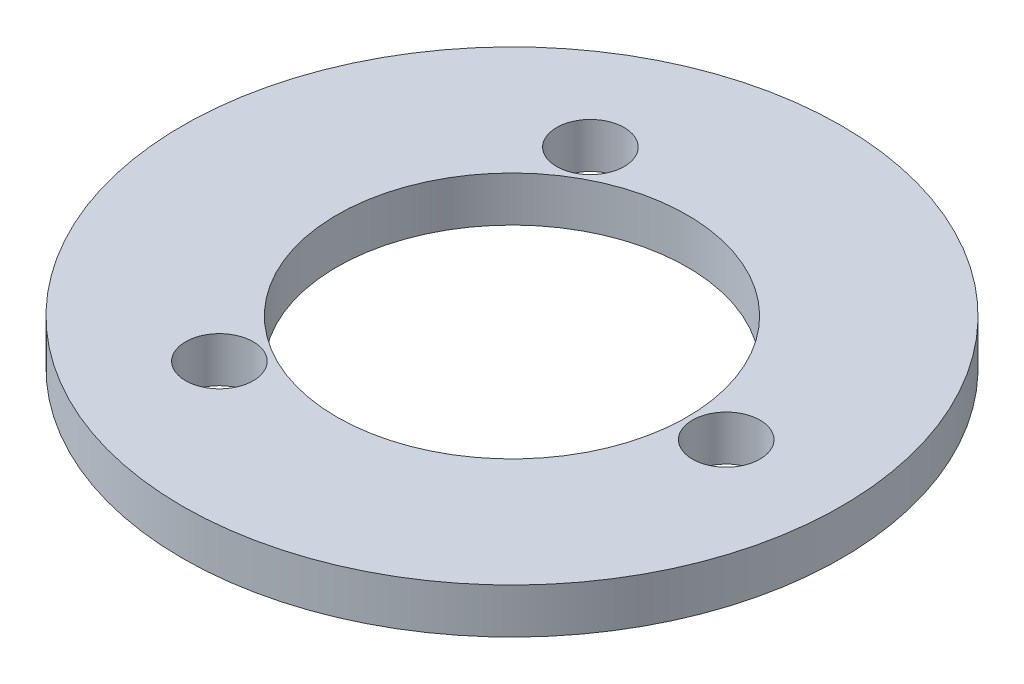
ISO-10303-21;
HEADER;
FILE_DESCRIPTION(('STEP AP214'),'2;1');
FILE_NAME('part.step','',(''),(''),'','','');
FILE_SCHEMA(('AUTOMOTIVE_DESIGN { 1 0 10303 214 1 1 1 1 }'));
ENDSEC;
DATA;
#1=APPLICATION_CONTEXT('core data for automotive mechanical design processes');
#2=APPLICATION_PROTOCOL_DEFINITION('international standard','automotive_design',2000,#1);
#3=PRODUCT_CONTEXT('',#1,'mechanical');
#4=PRODUCT('Part','Part','',(#3));
#5=PRODUCT_RELATED_PRODUCT_CATEGORY('part','',(#4));
#6=PRODUCT_DEFINITION_FORMATION('','',#4);
#7=PRODUCT_DEFINITION_CONTEXT('part definition',#1,'design');
#8=PRODUCT_DEFINITION('design','',#6,#7);
#9=PRODUCT_DEFINITION_SHAPE('','',#8);
#10=(LENGTH_UNIT() NAMED_UNIT(*) SI_UNIT(.MILLI.,.METRE.));
#11=(NAMED_UNIT(*) PLANE_ANGLE_UNIT() SI_UNIT($,.RADIAN.));
#12=(NAMED_UNIT(*) SI_UNIT($,.STERADIAN.) SOLID_ANGLE_UNIT());
#13=UNCERTAINTY_MEASURE_WITH_UNIT(LENGTH_MEASURE(1.E-05),#10,'distance_accuracy_value','');
#14=(GEOMETRIC_REPRESENTATION_CONTEXT(3) GLOBAL_UNCERTAINTY_ASSIGNED_CONTEXT((#13)) GLOBAL_UNIT_ASSIGNED_CONTEXT((#10,
#11,#12)) REPRESENTATION_CONTEXT('',''));
#15=CARTESIAN_POINT('',(0.,0.,0.));
#16=DIRECTION('',(0.,0.,1.));
#17=DIRECTION('',(1.,0.,0.));
#18=AXIS2_PLACEMENT_3D('',#15,#16,#17);
#19=CARTESIAN_POINT('',(-32.2459037817281,2.,-16.7860364028635));
#20=DIRECTION('',(0.,1.,0.));
#21=DIRECTION('',(0.,0.,1.));
#22=AXIS2_PLACEMENT_3D('',#19,#20,#21);
#23=PLANE('',#22);
#24=CARTESIAN_POINT('',(-36.9959234143415,2.,-25.0132664038902));
#25=DIRECTION('',(0.,1.,0.));
#26=DIRECTION('',(0.,0.,1.));
#27=AXIS2_PLACEMENT_3D('',#24,#25,#26);
#28=CIRCLE('',#27,1.50000000000053);
#29=CARTESIAN_POINT('',(-36.9959234143415,2.,-23.5132664038897));
#30=VERTEX_POINT('',#29);
#31=EDGE_CURVE('E64',#30,#30,#28,.T.);
#32=ORIENTED_EDGE('',*,*,#31,.F.);
#33=EDGE_LOOP('',(#32));
#34=FACE_BOUND('',#33,.T.);
#35=CARTESIAN_POINT('',(-32.2459037817281,2.,-16.7860364028635));
#36=DIRECTION('',(0.,1.,0.));
#37=DIRECTION('',(0.,0.,1.));
#38=AXIS2_PLACEMENT_3D('',#35,#36,#37);
#39=CIRCLE('',#38,7.76673220483759);
#40=CARTESIAN_POINT('',(-32.2459037817281,2.,-9.01930419802594));
#41=VERTEX_POINT('',#40);
#42=EDGE_CURVE('E50',#41,#41,#39,.T.);
#43=ORIENTED_EDGE('',*,*,#42,.F.);
#44=EDGE_LOOP('',(#43));
#45=FACE_BOUND('',#44,.T.);
#46=CARTESIAN_POINT('',(-32.2459037817281,2.,-16.7860364028635));
#47=DIRECTION('',(0.,1.,0.));
#48=DIRECTION('',(0.,0.,1.));
#49=AXIS2_PLACEMENT_3D('',#46,#47,#48);
#50=CIRCLE('',#49,14.6166364107663);
#51=CARTESIAN_POINT('',(-32.2459037817281,2.,-2.16939999209725));
#52=VERTEX_POINT('',#51);
#53=EDGE_CURVE('E10',#52,#52,#50,.T.);
#54=ORIENTED_EDGE('',*,*,#53,.T.);
#55=EDGE_LOOP('',(#54));
#56=FACE_BOUND('',#55,.T.);
#57=CARTESIAN_POINT('',(-36.9958841490876,2.,-8.55878373203273));
#58=DIRECTION('',(0.,1.,0.));
#59=DIRECTION('',(0.,0.,1.));
#60=AXIS2_PLACEMENT_3D('',#57,#58,#59);
#61=CIRCLE('',#60,1.50000000000077);
#62=CARTESIAN_POINT('',(-36.9958841490876,2.,-7.05878373203196));
#63=VERTEX_POINT('',#62);
#64=EDGE_CURVE('E56',#63,#63,#61,.T.);
#65=ORIENTED_EDGE('',*,*,#64,.F.);
#66=EDGE_LOOP('',(#65));
#67=FACE_BOUND('',#66,.T.);
#68=CARTESIAN_POINT('',(-22.7459037817551,2.,-16.7860590726688));
#69=DIRECTION('',(0.,1.,0.));
#70=DIRECTION('',(0.,0.,1.));
#71=AXIS2_PLACEMENT_3D('',#68,#69,#70);
#72=CIRCLE('',#71,1.5);
#73=CARTESIAN_POINT('',(-22.7459037817551,2.,-15.2860590726688));
#74=VERTEX_POINT('',#73);
#75=EDGE_CURVE('E72',#74,#74,#72,.T.);
#76=ORIENTED_EDGE('',*,*,#75,.F.);
#77=EDGE_LOOP('',(#76));
#78=FACE_BOUND('',#77,.T.);
#79=ADVANCED_FACE('F37',(#34,#45,#56,#67,#78),#23,.T.);
#80=CARTESIAN_POINT('',(-32.2459037817281,0.,-16.7860364028635));
#81=DIRECTION('',(0.,1.,0.));
#82=DIRECTION('',(0.,0.,1.));
#83=AXIS2_PLACEMENT_3D('',#80,#81,#82);
#84=PLANE('',#83);
#85=CARTESIAN_POINT('',(-32.2459037817281,0.,-16.7860364028635));
#86=DIRECTION('',(0.,1.,0.));
#87=DIRECTION('',(0.,0.,1.));
#88=AXIS2_PLACEMENT_3D('',#85,#86,#87);
#89=CIRCLE('',#88,14.6166364107663);
#90=CARTESIAN_POINT('',(-32.2459037817281,0.,-2.16939999209725));
#91=VERTEX_POINT('',#90);
#92=EDGE_CURVE('E41',#91,#91,#89,.T.);
#93=ORIENTED_EDGE('',*,*,#92,.F.);
#94=EDGE_LOOP('',(#93));
#95=FACE_BOUND('',#94,.T.);
#96=CARTESIAN_POINT('',(-32.2459037817281,0.,-16.7860364028635));
#97=DIRECTION('',(0.,1.,0.));
#98=DIRECTION('',(0.,0.,1.));
#99=AXIS2_PLACEMENT_3D('',#96,#97,#98);
#100=CIRCLE('',#99,7.76673220483759);
#101=CARTESIAN_POINT('',(-32.2459037817281,0.,-9.01930419802594));
#102=VERTEX_POINT('',#101);
#103=EDGE_CURVE('E52',#102,#102,#100,.T.);
#104=ORIENTED_EDGE('',*,*,#103,.T.);
#105=EDGE_LOOP('',(#104));
#106=FACE_BOUND('',#105,.T.);
#107=CARTESIAN_POINT('',(-36.9958841490876,0.,-8.55878373203273));
#108=DIRECTION('',(0.,1.,0.));
#109=DIRECTION('',(0.,0.,1.));
#110=AXIS2_PLACEMENT_3D('',#107,#108,#109);
#111=CIRCLE('',#110,1.50000000000077);
#112=CARTESIAN_POINT('',(-36.9958841490876,0.,-7.05878373203196));
#113=VERTEX_POINT('',#112);
#114=EDGE_CURVE('E60',#113,#113,#111,.T.);
#115=ORIENTED_EDGE('',*,*,#114,.T.);
#116=EDGE_LOOP('',(#115));
#117=FACE_BOUND('',#116,.T.);
#118=CARTESIAN_POINT('',(-36.9959234143415,0.,-25.0132664038902));
#119=DIRECTION('',(0.,1.,0.));
#120=DIRECTION('',(0.,0.,1.));
#121=AXIS2_PLACEMENT_3D('',#118,#119,#120);
#122=CIRCLE('',#121,1.50000000000053);
#123=CARTESIAN_POINT('',(-36.9959234143415,0.,-23.5132664038897));
#124=VERTEX_POINT('',#123);
#125=EDGE_CURVE('E68',#124,#124,#122,.T.);
#126=ORIENTED_EDGE('',*,*,#125,.T.);
#127=EDGE_LOOP('',(#126));
#128=FACE_BOUND('',#127,.T.);
#129=CARTESIAN_POINT('',(-22.7459037817551,0.,-16.7860590726688));
#130=DIRECTION('',(0.,1.,0.));
#131=DIRECTION('',(0.,0.,1.));
#132=AXIS2_PLACEMENT_3D('',#129,#130,#131);
#133=CIRCLE('',#132,1.5);
#134=CARTESIAN_POINT('',(-22.7459037817551,0.,-15.2860590726688));
#135=VERTEX_POINT('',#134);
#136=EDGE_CURVE('E76',#135,#135,#133,.T.);
#137=ORIENTED_EDGE('',*,*,#136,.T.);
#138=EDGE_LOOP('',(#137));
#139=FACE_BOUND('',#138,.T.);
#140=ADVANCED_FACE('F88',(#95,#106,#117,#128,#139),#84,.F.);
#141=CARTESIAN_POINT('',(-32.2459037817281,2.,-16.7860364028635));
#142=DIRECTION('',(0.,-1.,0.));
#143=DIRECTION('',(0.,0.,-1.));
#144=AXIS2_PLACEMENT_3D('',#141,#142,#143);
#145=CYLINDRICAL_SURFACE('',#144,14.6166364107663);
#146=ORIENTED_EDGE('',*,*,#53,.F.);
#147=EDGE_LOOP('',(#146));
#148=FACE_BOUND('',#147,.T.);
#149=ORIENTED_EDGE('',*,*,#92,.T.);
#150=EDGE_LOOP('',(#149));
#151=FACE_BOUND('',#150,.T.);
#152=ADVANCED_FACE('F39',(#148,#151),#145,.T.);
#153=CARTESIAN_POINT('',(-32.2459037817281,2.,-16.7860364028635));
#154=DIRECTION('',(0.,-1.,0.));
#155=DIRECTION('',(0.,0.,-1.));
#156=AXIS2_PLACEMENT_3D('',#153,#154,#155);
#157=CYLINDRICAL_SURFACE('',#156,7.76673220483759);
#158=ORIENTED_EDGE('',*,*,#42,.T.);
#159=EDGE_LOOP('',(#158));
#160=FACE_BOUND('',#159,.T.);
#161=ORIENTED_EDGE('',*,*,#103,.F.);
#162=EDGE_LOOP('',(#161));
#163=FACE_BOUND('',#162,.T.);
#164=ADVANCED_FACE('F98',(#160,#163),#157,.F.);
#165=CARTESIAN_POINT('',(-36.9958841490876,2.,-8.55878373203273));
#166=DIRECTION('',(0.,-1.,0.));
#167=DIRECTION('',(0.,0.,-1.));
#168=AXIS2_PLACEMENT_3D('',#165,#166,#167);
#169=CYLINDRICAL_SURFACE('',#168,1.50000000000077);
#170=ORIENTED_EDGE('',*,*,#64,.T.);
#171=EDGE_LOOP('',(#170));
#172=FACE_BOUND('',#171,.T.);
#173=ORIENTED_EDGE('',*,*,#114,.F.);
#174=EDGE_LOOP('',(#173));
#175=FACE_BOUND('',#174,.T.);
#176=ADVANCED_FACE('F101',(#172,#175),#169,.F.);
#177=CARTESIAN_POINT('',(-36.9959234143415,2.,-25.0132664038902));
#178=DIRECTION('',(0.,-1.,0.));
#179=DIRECTION('',(0.,0.,-1.));
#180=AXIS2_PLACEMENT_3D('',#177,#178,#179);
#181=CYLINDRICAL_SURFACE('',#180,1.50000000000053);
#182=ORIENTED_EDGE('',*,*,#31,.T.);
#183=EDGE_LOOP('',(#182));
#184=FACE_BOUND('',#183,.T.);
#185=ORIENTED_EDGE('',*,*,#125,.F.);
#186=EDGE_LOOP('',(#185));
#187=FACE_BOUND('',#186,.T.);
#188=ADVANCED_FACE('F105',(#184,#187),#181,.F.);
#189=CARTESIAN_POINT('',(-22.7459037817551,2.,-16.7860590726688));
#190=DIRECTION('',(0.,-1.,0.));
#191=DIRECTION('',(0.,0.,-1.));
#192=AXIS2_PLACEMENT_3D('',#189,#190,#191);
#193=CYLINDRICAL_SURFACE('',#192,1.5);
#194=ORIENTED_EDGE('',*,*,#75,.T.);
#195=EDGE_LOOP('',(#194));
#196=FACE_BOUND('',#195,.T.);
#197=ORIENTED_EDGE('',*,*,#136,.F.);
#198=EDGE_LOOP('',(#197));
#199=FACE_BOUND('',#198,.T.);
#200=ADVANCED_FACE('F84',(#196,#199),#193,.F.);
#201=CLOSED_SHELL('',(#79,#140,#152,#164,#176,#188,#200));
#202=MANIFOLD_SOLID_BREP('B2',#201);
#203=ADVANCED_BREP_SHAPE_REPRESENTATION('',(#18,#202),#14);
#204=SHAPE_DEFINITION_REPRESENTATION(#9,#203);
ENDSEC;
END-ISO-10303-21;
